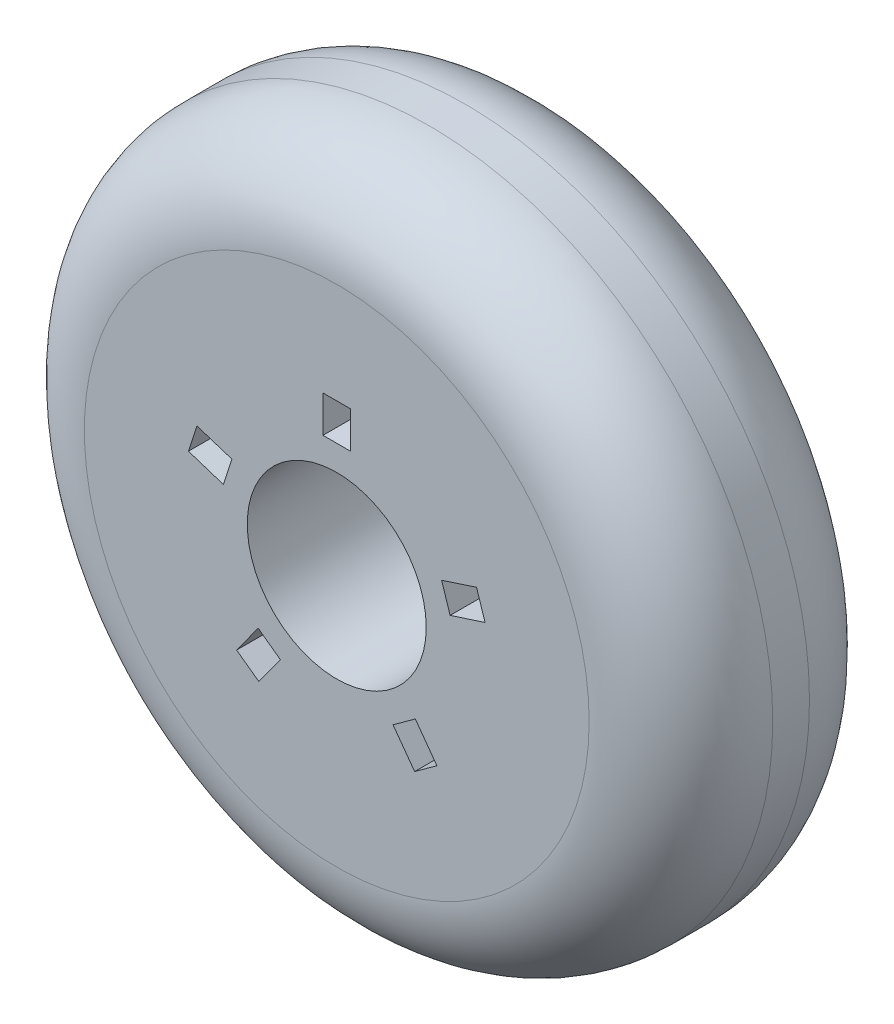
ISO-10303-21;
HEADER;
FILE_DESCRIPTION(('STEP AP214'),'2;1');
FILE_NAME('part.step','',(''),(''),'','','');
FILE_SCHEMA(('AUTOMOTIVE_DESIGN { 1 0 10303 214 1 1 1 1 }'));
ENDSEC;
DATA;
#1=APPLICATION_CONTEXT('core data for automotive mechanical design processes');
#2=APPLICATION_PROTOCOL_DEFINITION('international standard','automotive_design',2000,#1);
#3=PRODUCT_CONTEXT('',#1,'mechanical');
#4=PRODUCT('Part','Part','',(#3));
#5=PRODUCT_RELATED_PRODUCT_CATEGORY('part','',(#4));
#6=PRODUCT_DEFINITION_FORMATION('','',#4);
#7=PRODUCT_DEFINITION_CONTEXT('part definition',#1,'design');
#8=PRODUCT_DEFINITION('design','',#6,#7);
#9=PRODUCT_DEFINITION_SHAPE('','',#8);
#10=(LENGTH_UNIT() NAMED_UNIT(*) SI_UNIT(.MILLI.,.METRE.));
#11=(NAMED_UNIT(*) PLANE_ANGLE_UNIT() SI_UNIT($,.RADIAN.));
#12=(NAMED_UNIT(*) SI_UNIT($,.STERADIAN.) SOLID_ANGLE_UNIT());
#13=UNCERTAINTY_MEASURE_WITH_UNIT(LENGTH_MEASURE(1.E-05),#10,'distance_accuracy_value','');
#14=(GEOMETRIC_REPRESENTATION_CONTEXT(3) GLOBAL_UNCERTAINTY_ASSIGNED_CONTEXT((#13)) GLOBAL_UNIT_ASSIGNED_CONTEXT((#10,
#11,#12)) REPRESENTATION_CONTEXT('',''));
#15=CARTESIAN_POINT('',(0.,0.,0.));
#16=DIRECTION('',(0.,0.,1.));
#17=DIRECTION('',(1.,0.,0.));
#18=AXIS2_PLACEMENT_3D('',#15,#16,#17);
#19=CARTESIAN_POINT('',(0.,0.,24.));
#20=DIRECTION('',(0.,0.,1.));
#21=DIRECTION('',(1.,0.,0.));
#22=AXIS2_PLACEMENT_3D('',#19,#20,#21);
#23=PLANE('',#22);
#24=DIRECTION('',(0.,-1.,0.));
#25=VECTOR('',#24,1.);
#26=CARTESIAN_POINT('',(-1.5,16.5,24.));
#27=LINE('',#26,#25);
#28=CARTESIAN_POINT('',(-1.5,16.5,24.));
#29=VERTEX_POINT('',#28);
#30=CARTESIAN_POINT('',(-1.5,12.5,24.));
#31=VERTEX_POINT('',#30);
#32=EDGE_CURVE('E63',#29,#31,#27,.T.);
#33=ORIENTED_EDGE('',*,*,#32,.F.);
#34=DIRECTION('',(-1.,0.,0.));
#35=VECTOR('',#34,1.);
#36=CARTESIAN_POINT('',(-1.5,16.5,24.));
#37=LINE('',#36,#35);
#38=CARTESIAN_POINT('',(1.5,16.5,24.));
#39=VERTEX_POINT('',#38);
#40=EDGE_CURVE('E209',#39,#29,#37,.T.);
#41=ORIENTED_EDGE('',*,*,#40,.F.);
#42=DIRECTION('',(0.,1.,0.));
#43=VECTOR('',#42,1.);
#44=CARTESIAN_POINT('',(1.5,16.5,24.));
#45=LINE('',#44,#43);
#46=CARTESIAN_POINT('',(1.5,12.5,24.));
#47=VERTEX_POINT('',#46);
#48=EDGE_CURVE('E213',#47,#39,#45,.T.);
#49=ORIENTED_EDGE('',*,*,#48,.F.);
#50=DIRECTION('',(1.,0.,0.));
#51=VECTOR('',#50,1.);
#52=CARTESIAN_POINT('',(-1.5,12.5,24.));
#53=LINE('',#52,#51);
#54=EDGE_CURVE('E222',#31,#47,#53,.T.);
#55=ORIENTED_EDGE('',*,*,#54,.F.);
#56=EDGE_LOOP('',(#33,#41,#49,#55));
#57=FACE_BOUND('',#56,.T.);
#58=DIRECTION('',(-0.951056516295153,-0.309016994374948,0.));
#59=VECTOR('',#58,1.);
#60=CARTESIAN_POINT('',(15.228907027308,6.52536518162999,24.));
#61=LINE('',#60,#59);
#62=CARTESIAN_POINT('',(15.228907027308,6.52536518162999,24.));
#63=VERTEX_POINT('',#62);
#64=CARTESIAN_POINT('',(11.4246809621274,5.28929720413019,24.));
#65=VERTEX_POINT('',#64);
#66=EDGE_CURVE('E71',#63,#65,#61,.T.);
#67=ORIENTED_EDGE('',*,*,#66,.F.);
#68=DIRECTION('',(-0.309016994374948,0.951056516295154,0.));
#69=VECTOR('',#68,1.);
#70=CARTESIAN_POINT('',(15.228907027308,6.52536518162999,24.));
#71=LINE('',#70,#69);
#72=CARTESIAN_POINT('',(16.1559580104328,3.67219563274452,24.));
#73=VERTEX_POINT('',#72);
#74=EDGE_CURVE('E251',#73,#63,#71,.T.);
#75=ORIENTED_EDGE('',*,*,#74,.F.);
#76=DIRECTION('',(0.951056516295154,0.309016994374948,0.));
#77=VECTOR('',#76,1.);
#78=CARTESIAN_POINT('',(16.1559580104328,3.67219563274452,24.));
#79=LINE('',#78,#77);
#80=CARTESIAN_POINT('',(12.3517319452522,2.43612765524473,24.));
#81=VERTEX_POINT('',#80);
#82=EDGE_CURVE('E255',#81,#73,#79,.T.);
#83=ORIENTED_EDGE('',*,*,#82,.F.);
#84=DIRECTION('',(0.309016994374947,-0.951056516295154,0.));
#85=VECTOR('',#84,1.);
#86=CARTESIAN_POINT('',(11.4246809621274,5.28929720413019,24.));
#87=LINE('',#86,#85);
#88=EDGE_CURVE('E260',#65,#81,#87,.T.);
#89=ORIENTED_EDGE('',*,*,#88,.F.);
#90=EDGE_LOOP('',(#67,#75,#83,#89));
#91=FACE_BOUND('',#90,.T.);
#92=DIRECTION('',(-0.587785252292473,0.809016994374947,0.));
#93=VECTOR('',#92,1.);
#94=CARTESIAN_POINT('',(10.9119821543893,-12.4671025287475,24.));
#95=LINE('',#94,#93);
#96=CARTESIAN_POINT('',(10.9119821543893,-12.4671025287475,24.));
#97=VERTEX_POINT('',#96);
#98=CARTESIAN_POINT('',(8.5608411452194,-9.23103455124766,24.));
#99=VERTEX_POINT('',#98);
#100=EDGE_CURVE('E250',#97,#99,#95,.T.);
#101=ORIENTED_EDGE('',*,*,#100,.F.);
#102=DIRECTION('',(0.809016994374947,0.587785252292473,0.));
#103=VECTOR('',#102,1.);
#104=CARTESIAN_POINT('',(10.9119821543893,-12.4671025287475,24.));
#105=LINE('',#104,#103);
#106=CARTESIAN_POINT('',(8.48493117126445,-14.2304582856249,24.));
#107=VERTEX_POINT('',#106);
#108=EDGE_CURVE('E295',#107,#97,#105,.T.);
#109=ORIENTED_EDGE('',*,*,#108,.F.);
#110=DIRECTION('',(0.587785252292474,-0.809016994374947,0.));
#111=VECTOR('',#110,1.);
#112=CARTESIAN_POINT('',(8.48493117126445,-14.2304582856249,24.));
#113=LINE('',#112,#111);
#114=CARTESIAN_POINT('',(6.13379016209456,-10.9943903081251,24.));
#115=VERTEX_POINT('',#114);
#116=EDGE_CURVE('E299',#115,#107,#113,.T.);
#117=ORIENTED_EDGE('',*,*,#116,.F.);
#118=DIRECTION('',(-0.809016994374947,-0.587785252292474,0.));
#119=VECTOR('',#118,1.);
#120=CARTESIAN_POINT('',(8.5608411452194,-9.23103455124767,24.));
#121=LINE('',#120,#119);
#122=EDGE_CURVE('E304',#99,#115,#121,.T.);
#123=ORIENTED_EDGE('',*,*,#122,.F.);
#124=EDGE_LOOP('',(#101,#109,#117,#123));
#125=FACE_BOUND('',#124,.T.);
#126=DIRECTION('',(0.587785252292473,0.809016994374947,0.));
#127=VECTOR('',#126,1.);
#128=CARTESIAN_POINT('',(-8.48493117126225,-14.2304582856256,24.));
#129=LINE('',#128,#127);
#130=CARTESIAN_POINT('',(-8.48493117126225,-14.2304582856256,24.));
#131=VERTEX_POINT('',#130);
#132=CARTESIAN_POINT('',(-6.13379016209236,-10.9943903081258,24.));
#133=VERTEX_POINT('',#132);
#134=EDGE_CURVE('E294',#131,#133,#129,.T.);
#135=ORIENTED_EDGE('',*,*,#134,.F.);
#136=DIRECTION('',(0.809016994374947,-0.587785252292473,0.));
#137=VECTOR('',#136,1.);
#138=CARTESIAN_POINT('',(-8.48493117126225,-14.2304582856256,24.));
#139=LINE('',#138,#137);
#140=CARTESIAN_POINT('',(-10.9119821543871,-12.4671025287482,24.));
#141=VERTEX_POINT('',#140);
#142=EDGE_CURVE('E339',#141,#131,#139,.T.);
#143=ORIENTED_EDGE('',*,*,#142,.F.);
#144=DIRECTION('',(-0.587785252292473,-0.809016994374948,0.));
#145=VECTOR('',#144,1.);
#146=CARTESIAN_POINT('',(-10.9119821543871,-12.4671025287482,24.));
#147=LINE('',#146,#145);
#148=CARTESIAN_POINT('',(-8.5608411452172,-9.23103455124839,24.));
#149=VERTEX_POINT('',#148);
#150=EDGE_CURVE('E343',#149,#141,#147,.T.);
#151=ORIENTED_EDGE('',*,*,#150,.F.);
#152=DIRECTION('',(-0.809016994374948,0.587785252292472,0.));
#153=VECTOR('',#152,1.);
#154=CARTESIAN_POINT('',(-6.13379016209236,-10.9943903081258,24.));
#155=LINE('',#154,#153);
#156=EDGE_CURVE('E348',#133,#149,#155,.T.);
#157=ORIENTED_EDGE('',*,*,#156,.F.);
#158=EDGE_LOOP('',(#135,#143,#151,#157));
#159=FACE_BOUND('',#158,.T.);
#160=DIRECTION('',(0.951056516295154,-0.309016994374947,0.));
#161=VECTOR('',#160,1.);
#162=CARTESIAN_POINT('',(-16.155958010432,3.67219563274336,24.));
#163=LINE('',#162,#161);
#164=CARTESIAN_POINT('',(-16.155958010432,3.67219563274336,24.));
#165=VERTEX_POINT('',#164);
#166=CARTESIAN_POINT('',(-12.3517319452514,2.43612765524357,24.));
#167=VERTEX_POINT('',#166);
#168=EDGE_CURVE('E338',#165,#167,#163,.T.);
#169=ORIENTED_EDGE('',*,*,#168,.F.);
#170=DIRECTION('',(-0.309016994374948,-0.951056516295153,0.));
#171=VECTOR('',#170,1.);
#172=CARTESIAN_POINT('',(-16.155958010432,3.67219563274336,24.));
#173=LINE('',#172,#171);
#174=CARTESIAN_POINT('',(-15.2289070273071,6.52536518162882,24.));
#175=VERTEX_POINT('',#174);
#176=EDGE_CURVE('E382',#175,#165,#173,.T.);
#177=ORIENTED_EDGE('',*,*,#176,.F.);
#178=DIRECTION('',(-0.951056516295154,0.309016994374947,0.));
#179=VECTOR('',#178,1.);
#180=CARTESIAN_POINT('',(-15.2289070273071,6.52536518162882,24.));
#181=LINE('',#180,#179);
#182=CARTESIAN_POINT('',(-11.4246809621265,5.28929720412903,24.));
#183=VERTEX_POINT('',#182);
#184=EDGE_CURVE('E386',#183,#175,#181,.T.);
#185=ORIENTED_EDGE('',*,*,#184,.F.);
#186=DIRECTION('',(0.309016994374947,0.951056516295154,0.));
#187=VECTOR('',#186,1.);
#188=CARTESIAN_POINT('',(-12.3517319452514,2.43612765524357,24.));
#189=LINE('',#188,#187);
#190=EDGE_CURVE('E391',#167,#183,#189,.T.);
#191=ORIENTED_EDGE('',*,*,#190,.F.);
#192=EDGE_LOOP('',(#169,#177,#185,#191));
#193=FACE_BOUND('',#192,.T.);
#194=CARTESIAN_POINT('',(0.,0.,24.));
#195=DIRECTION('',(0.,0.,1.));
#196=DIRECTION('',(1.,0.,0.));
#197=AXIS2_PLACEMENT_3D('',#194,#195,#196);
#198=CIRCLE('',#197,27.5);
#199=CARTESIAN_POINT('',(27.5,0.,24.));
#200=VERTEX_POINT('',#199);
#201=EDGE_CURVE('E11',#200,#200,#198,.T.);
#202=ORIENTED_EDGE('',*,*,#201,.T.);
#203=EDGE_LOOP('',(#202));
#204=FACE_BOUND('',#203,.T.);
#205=CARTESIAN_POINT('',(0.,0.,24.));
#206=DIRECTION('',(0.,0.,1.));
#207=DIRECTION('',(1.,0.,0.));
#208=AXIS2_PLACEMENT_3D('',#205,#206,#207);
#209=CIRCLE('',#208,9.75);
#210=CARTESIAN_POINT('',(9.75,0.,24.));
#211=VERTEX_POINT('',#210);
#212=EDGE_CURVE('E411',#211,#211,#209,.T.);
#213=ORIENTED_EDGE('',*,*,#212,.F.);
#214=EDGE_LOOP('',(#213));
#215=FACE_BOUND('',#214,.T.);
#216=ADVANCED_FACE('F47',(#57,#91,#125,#159,#193,#204,#215),#23,.T.);
#217=CARTESIAN_POINT('',(0.,0.,0.));
#218=DIRECTION('',(0.,0.,1.));
#219=DIRECTION('',(1.,0.,0.));
#220=AXIS2_PLACEMENT_3D('',#217,#218,#219);
#221=PLANE('',#220);
#222=DIRECTION('',(-1.,0.,0.));
#223=VECTOR('',#222,1.);
#224=CARTESIAN_POINT('',(-1.5,16.5,0.));
#225=LINE('',#224,#223);
#226=CARTESIAN_POINT('',(1.5,16.5,0.));
#227=VERTEX_POINT('',#226);
#228=CARTESIAN_POINT('',(-1.5,16.5,0.));
#229=VERTEX_POINT('',#228);
#230=EDGE_CURVE('E194',#227,#229,#225,.T.);
#231=ORIENTED_EDGE('',*,*,#230,.T.);
#232=DIRECTION('',(0.,-1.,0.));
#233=VECTOR('',#232,1.);
#234=CARTESIAN_POINT('',(-1.5,16.5,0.));
#235=LINE('',#234,#233);
#236=CARTESIAN_POINT('',(-1.5,12.5,0.));
#237=VERTEX_POINT('',#236);
#238=EDGE_CURVE('E187',#229,#237,#235,.T.);
#239=ORIENTED_EDGE('',*,*,#238,.T.);
#240=DIRECTION('',(1.,0.,0.));
#241=VECTOR('',#240,1.);
#242=CARTESIAN_POINT('',(-1.5,12.5,0.));
#243=LINE('',#242,#241);
#244=CARTESIAN_POINT('',(1.5,12.5,0.));
#245=VERTEX_POINT('',#244);
#246=EDGE_CURVE('E198',#237,#245,#243,.T.);
#247=ORIENTED_EDGE('',*,*,#246,.T.);
#248=DIRECTION('',(0.,1.,0.));
#249=VECTOR('',#248,1.);
#250=CARTESIAN_POINT('',(1.5,16.5,0.));
#251=LINE('',#250,#249);
#252=EDGE_CURVE('E203',#245,#227,#251,.T.);
#253=ORIENTED_EDGE('',*,*,#252,.T.);
#254=EDGE_LOOP('',(#231,#239,#247,#253));
#255=FACE_BOUND('',#254,.T.);
#256=DIRECTION('',(-0.309016994374948,0.951056516295154,0.));
#257=VECTOR('',#256,1.);
#258=CARTESIAN_POINT('',(15.228907027308,6.52536518162999,0.));
#259=LINE('',#258,#257);
#260=CARTESIAN_POINT('',(16.1559580104328,3.67219563274452,0.));
#261=VERTEX_POINT('',#260);
#262=CARTESIAN_POINT('',(15.228907027308,6.52536518162999,0.));
#263=VERTEX_POINT('',#262);
#264=EDGE_CURVE('E240',#261,#263,#259,.T.);
#265=ORIENTED_EDGE('',*,*,#264,.T.);
#266=DIRECTION('',(-0.951056516295153,-0.309016994374948,0.));
#267=VECTOR('',#266,1.);
#268=CARTESIAN_POINT('',(15.228907027308,6.52536518162999,0.));
#269=LINE('',#268,#267);
#270=CARTESIAN_POINT('',(11.4246809621274,5.28929720413019,0.));
#271=VERTEX_POINT('',#270);
#272=EDGE_CURVE('E256',#263,#271,#269,.T.);
#273=ORIENTED_EDGE('',*,*,#272,.T.);
#274=DIRECTION('',(0.309016994374947,-0.951056516295154,0.));
#275=VECTOR('',#274,1.);
#276=CARTESIAN_POINT('',(11.4246809621274,5.28929720413019,0.));
#277=LINE('',#276,#275);
#278=CARTESIAN_POINT('',(12.3517319452522,2.43612765524473,0.));
#279=VERTEX_POINT('',#278);
#280=EDGE_CURVE('E273',#271,#279,#277,.T.);
#281=ORIENTED_EDGE('',*,*,#280,.T.);
#282=DIRECTION('',(0.951056516295154,0.309016994374948,0.));
#283=VECTOR('',#282,1.);
#284=CARTESIAN_POINT('',(16.1559580104328,3.67219563274452,0.));
#285=LINE('',#284,#283);
#286=EDGE_CURVE('E269',#279,#261,#285,.T.);
#287=ORIENTED_EDGE('',*,*,#286,.T.);
#288=EDGE_LOOP('',(#265,#273,#281,#287));
#289=FACE_BOUND('',#288,.T.);
#290=DIRECTION('',(0.809016994374947,0.587785252292473,0.));
#291=VECTOR('',#290,1.);
#292=CARTESIAN_POINT('',(10.9119821543893,-12.4671025287475,0.));
#293=LINE('',#292,#291);
#294=CARTESIAN_POINT('',(8.48493117126445,-14.2304582856249,0.));
#295=VERTEX_POINT('',#294);
#296=CARTESIAN_POINT('',(10.9119821543893,-12.4671025287475,0.));
#297=VERTEX_POINT('',#296);
#298=EDGE_CURVE('E284',#295,#297,#293,.T.);
#299=ORIENTED_EDGE('',*,*,#298,.T.);
#300=DIRECTION('',(-0.587785252292473,0.809016994374947,0.));
#301=VECTOR('',#300,1.);
#302=CARTESIAN_POINT('',(10.9119821543893,-12.4671025287475,0.));
#303=LINE('',#302,#301);
#304=CARTESIAN_POINT('',(8.5608411452194,-9.23103455124767,0.));
#305=VERTEX_POINT('',#304);
#306=EDGE_CURVE('E300',#297,#305,#303,.T.);
#307=ORIENTED_EDGE('',*,*,#306,.T.);
#308=DIRECTION('',(-0.809016994374947,-0.587785252292474,0.));
#309=VECTOR('',#308,1.);
#310=CARTESIAN_POINT('',(8.5608411452194,-9.23103455124767,0.));
#311=LINE('',#310,#309);
#312=CARTESIAN_POINT('',(6.13379016209456,-10.9943903081251,0.));
#313=VERTEX_POINT('',#312);
#314=EDGE_CURVE('E317',#305,#313,#311,.T.);
#315=ORIENTED_EDGE('',*,*,#314,.T.);
#316=DIRECTION('',(0.587785252292474,-0.809016994374947,0.));
#317=VECTOR('',#316,1.);
#318=CARTESIAN_POINT('',(8.48493117126445,-14.2304582856249,0.));
#319=LINE('',#318,#317);
#320=EDGE_CURVE('E313',#313,#295,#319,.T.);
#321=ORIENTED_EDGE('',*,*,#320,.T.);
#322=EDGE_LOOP('',(#299,#307,#315,#321));
#323=FACE_BOUND('',#322,.T.);
#324=DIRECTION('',(0.809016994374947,-0.587785252292473,0.));
#325=VECTOR('',#324,1.);
#326=CARTESIAN_POINT('',(-8.48493117126225,-14.2304582856256,0.));
#327=LINE('',#326,#325);
#328=CARTESIAN_POINT('',(-10.9119821543871,-12.4671025287482,0.));
#329=VERTEX_POINT('',#328);
#330=CARTESIAN_POINT('',(-8.48493117126225,-14.2304582856256,0.));
#331=VERTEX_POINT('',#330);
#332=EDGE_CURVE('E328',#329,#331,#327,.T.);
#333=ORIENTED_EDGE('',*,*,#332,.T.);
#334=DIRECTION('',(0.587785252292473,0.809016994374947,0.));
#335=VECTOR('',#334,1.);
#336=CARTESIAN_POINT('',(-8.48493117126225,-14.2304582856256,0.));
#337=LINE('',#336,#335);
#338=CARTESIAN_POINT('',(-6.13379016209236,-10.9943903081258,0.));
#339=VERTEX_POINT('',#338);
#340=EDGE_CURVE('E344',#331,#339,#337,.T.);
#341=ORIENTED_EDGE('',*,*,#340,.T.);
#342=DIRECTION('',(-0.809016994374948,0.587785252292472,0.));
#343=VECTOR('',#342,1.);
#344=CARTESIAN_POINT('',(-6.13379016209236,-10.9943903081258,0.));
#345=LINE('',#344,#343);
#346=CARTESIAN_POINT('',(-8.5608411452172,-9.23103455124839,0.));
#347=VERTEX_POINT('',#346);
#348=EDGE_CURVE('E361',#339,#347,#345,.T.);
#349=ORIENTED_EDGE('',*,*,#348,.T.);
#350=DIRECTION('',(-0.587785252292473,-0.809016994374948,0.));
#351=VECTOR('',#350,1.);
#352=CARTESIAN_POINT('',(-10.9119821543871,-12.4671025287482,0.));
#353=LINE('',#352,#351);
#354=EDGE_CURVE('E357',#347,#329,#353,.T.);
#355=ORIENTED_EDGE('',*,*,#354,.T.);
#356=EDGE_LOOP('',(#333,#341,#349,#355));
#357=FACE_BOUND('',#356,.T.);
#358=DIRECTION('',(-0.309016994374948,-0.951056516295153,0.));
#359=VECTOR('',#358,1.);
#360=CARTESIAN_POINT('',(-16.155958010432,3.67219563274336,0.));
#361=LINE('',#360,#359);
#362=CARTESIAN_POINT('',(-15.2289070273071,6.52536518162882,0.));
#363=VERTEX_POINT('',#362);
#364=CARTESIAN_POINT('',(-16.155958010432,3.67219563274336,0.));
#365=VERTEX_POINT('',#364);
#366=EDGE_CURVE('E372',#363,#365,#361,.T.);
#367=ORIENTED_EDGE('',*,*,#366,.T.);
#368=DIRECTION('',(0.951056516295154,-0.309016994374947,0.));
#369=VECTOR('',#368,1.);
#370=CARTESIAN_POINT('',(-16.155958010432,3.67219563274336,0.));
#371=LINE('',#370,#369);
#372=CARTESIAN_POINT('',(-12.3517319452514,2.43612765524357,0.));
#373=VERTEX_POINT('',#372);
#374=EDGE_CURVE('E387',#365,#373,#371,.T.);
#375=ORIENTED_EDGE('',*,*,#374,.T.);
#376=DIRECTION('',(0.309016994374947,0.951056516295154,0.));
#377=VECTOR('',#376,1.);
#378=CARTESIAN_POINT('',(-12.3517319452514,2.43612765524357,0.));
#379=LINE('',#378,#377);
#380=CARTESIAN_POINT('',(-11.4246809621265,5.28929720412903,0.));
#381=VERTEX_POINT('',#380);
#382=EDGE_CURVE('E404',#373,#381,#379,.T.);
#383=ORIENTED_EDGE('',*,*,#382,.T.);
#384=DIRECTION('',(-0.951056516295154,0.309016994374947,0.));
#385=VECTOR('',#384,1.);
#386=CARTESIAN_POINT('',(-15.2289070273071,6.52536518162882,0.));
#387=LINE('',#386,#385);
#388=EDGE_CURVE('E400',#381,#363,#387,.T.);
#389=ORIENTED_EDGE('',*,*,#388,.T.);
#390=EDGE_LOOP('',(#367,#375,#383,#389));
#391=FACE_BOUND('',#390,.T.);
#392=CARTESIAN_POINT('',(0.,0.,0.));
#393=DIRECTION('',(0.,0.,1.));
#394=DIRECTION('',(1.,0.,0.));
#395=AXIS2_PLACEMENT_3D('',#392,#393,#394);
#396=CIRCLE('',#395,27.5);
#397=CARTESIAN_POINT('',(27.5,0.,0.));
#398=VERTEX_POINT('',#397);
#399=EDGE_CURVE('E56',#398,#398,#396,.F.);
#400=ORIENTED_EDGE('',*,*,#399,.T.);
#401=EDGE_LOOP('',(#400));
#402=FACE_BOUND('',#401,.T.);
#403=CARTESIAN_POINT('',(0.,0.,0.));
#404=DIRECTION('',(0.,0.,1.));
#405=DIRECTION('',(1.,0.,0.));
#406=AXIS2_PLACEMENT_3D('',#403,#404,#405);
#407=CIRCLE('',#406,9.75);
#408=CARTESIAN_POINT('',(9.75,0.,0.));
#409=VERTEX_POINT('',#408);
#410=EDGE_CURVE('E231',#409,#409,#407,.T.);
#411=ORIENTED_EDGE('',*,*,#410,.T.);
#412=EDGE_LOOP('',(#411));
#413=FACE_BOUND('',#412,.T.);
#414=ADVANCED_FACE('F205',(#255,#289,#323,#357,#391,#402,#413),#221,.F.);
#415=CARTESIAN_POINT('',(0.,0.,24.));
#416=DIRECTION('',(0.,0.,-1.));
#417=DIRECTION('',(-1.,0.,0.));
#418=AXIS2_PLACEMENT_3D('',#415,#416,#417);
#419=CYLINDRICAL_SURFACE('',#418,37.5);
#420=CARTESIAN_POINT('',(0.,0.,10.));
#421=DIRECTION('',(0.,0.,1.));
#422=DIRECTION('',(1.,0.,0.));
#423=AXIS2_PLACEMENT_3D('',#420,#421,#422);
#424=CIRCLE('',#423,37.5);
#425=CARTESIAN_POINT('',(37.5,0.,10.));
#426=VERTEX_POINT('',#425);
#427=EDGE_CURVE('E422',#426,#426,#424,.T.);
#428=ORIENTED_EDGE('',*,*,#427,.T.);
#429=EDGE_LOOP('',(#428));
#430=FACE_BOUND('',#429,.T.);
#431=CARTESIAN_POINT('',(0.,0.,14.));
#432=DIRECTION('',(0.,0.,1.));
#433=DIRECTION('',(1.,0.,0.));
#434=AXIS2_PLACEMENT_3D('',#431,#432,#433);
#435=CIRCLE('',#434,37.5);
#436=CARTESIAN_POINT('',(37.5,0.,14.));
#437=VERTEX_POINT('',#436);
#438=EDGE_CURVE('E415',#437,#437,#435,.F.);
#439=ORIENTED_EDGE('',*,*,#438,.T.);
#440=EDGE_LOOP('',(#439));
#441=FACE_BOUND('',#440,.T.);
#442=ADVANCED_FACE('F437',(#430,#441),#419,.T.);
#443=CARTESIAN_POINT('',(0.,0.,24.));
#444=DIRECTION('',(0.,0.,-1.));
#445=DIRECTION('',(-1.,0.,0.));
#446=AXIS2_PLACEMENT_3D('',#443,#444,#445);
#447=CYLINDRICAL_SURFACE('',#446,9.75);
#448=ORIENTED_EDGE('',*,*,#212,.T.);
#449=EDGE_LOOP('',(#448));
#450=FACE_BOUND('',#449,.T.);
#451=ORIENTED_EDGE('',*,*,#410,.F.);
#452=EDGE_LOOP('',(#451));
#453=FACE_BOUND('',#452,.T.);
#454=ADVANCED_FACE('F434',(#450,#453),#447,.F.);
#455=CARTESIAN_POINT('',(0.,0.,10.));
#456=DIRECTION('',(0.,0.,1.));
#457=DIRECTION('',(1.,0.,0.));
#458=AXIS2_PLACEMENT_3D('',#455,#456,#457);
#459=TOROIDAL_SURFACE('',#458,27.5,10.);
#460=ORIENTED_EDGE('',*,*,#399,.F.);
#461=EDGE_LOOP('',(#460));
#462=FACE_BOUND('',#461,.T.);
#463=ORIENTED_EDGE('',*,*,#427,.F.);
#464=EDGE_LOOP('',(#463));
#465=FACE_BOUND('',#464,.T.);
#466=ADVANCED_FACE('F431',(#462,#465),#459,.T.);
#467=CARTESIAN_POINT('',(0.,0.,14.));
#468=DIRECTION('',(0.,0.,1.));
#469=DIRECTION('',(1.,0.,0.));
#470=AXIS2_PLACEMENT_3D('',#467,#468,#469);
#471=TOROIDAL_SURFACE('',#470,27.5,10.);
#472=ORIENTED_EDGE('',*,*,#438,.F.);
#473=EDGE_LOOP('',(#472));
#474=FACE_BOUND('',#473,.T.);
#475=ORIENTED_EDGE('',*,*,#201,.F.);
#476=EDGE_LOOP('',(#475));
#477=FACE_BOUND('',#476,.T.);
#478=ADVANCED_FACE('F49',(#474,#477),#471,.T.);
#479=CARTESIAN_POINT('',(-16.155958010432,3.67219563274336,0.));
#480=DIRECTION('',(-0.309016994374947,-0.951056516295154,0.));
#481=DIRECTION('',(0.951056516295154,-0.309016994374947,0.));
#482=AXIS2_PLACEMENT_3D('',#479,#480,#481);
#483=PLANE('',#482);
#484=ORIENTED_EDGE('',*,*,#168,.T.);
#485=DIRECTION('',(0.,0.,1.));
#486=VECTOR('',#485,1.);
#487=CARTESIAN_POINT('',(-12.3517319452514,2.43612765524357,0.));
#488=LINE('',#487,#486);
#489=EDGE_CURVE('E368',#373,#167,#488,.T.);
#490=ORIENTED_EDGE('',*,*,#489,.F.);
#491=ORIENTED_EDGE('',*,*,#374,.F.);
#492=DIRECTION('',(0.,0.,1.));
#493=VECTOR('',#492,1.);
#494=CARTESIAN_POINT('',(-16.155958010432,3.67219563274336,0.));
#495=LINE('',#494,#493);
#496=EDGE_CURVE('E379',#365,#165,#495,.T.);
#497=ORIENTED_EDGE('',*,*,#496,.T.);
#498=EDGE_LOOP('',(#484,#490,#491,#497));
#499=FACE_BOUND('',#498,.T.);
#500=ADVANCED_FACE('F445',(#499),#483,.F.);
#501=CARTESIAN_POINT('',(-16.155958010432,3.67219563274336,0.));
#502=DIRECTION('',(-0.951056516295154,0.309016994374948,0.));
#503=DIRECTION('',(-0.309016994374948,-0.951056516295154,0.));
#504=AXIS2_PLACEMENT_3D('',#501,#502,#503);
#505=PLANE('',#504);
#506=ORIENTED_EDGE('',*,*,#176,.T.);
#507=ORIENTED_EDGE('',*,*,#496,.F.);
#508=ORIENTED_EDGE('',*,*,#366,.F.);
#509=DIRECTION('',(0.,0.,1.));
#510=VECTOR('',#509,1.);
#511=CARTESIAN_POINT('',(-15.2289070273071,6.52536518162882,0.));
#512=LINE('',#511,#510);
#513=EDGE_CURVE('E376',#363,#175,#512,.T.);
#514=ORIENTED_EDGE('',*,*,#513,.T.);
#515=EDGE_LOOP('',(#506,#507,#508,#514));
#516=FACE_BOUND('',#515,.T.);
#517=ADVANCED_FACE('F464',(#516),#505,.F.);
#518=CARTESIAN_POINT('',(-15.2289070273071,6.52536518162882,0.));
#519=DIRECTION('',(0.309016994374947,0.951056516295154,0.));
#520=DIRECTION('',(-0.951056516295154,0.309016994374947,0.));
#521=AXIS2_PLACEMENT_3D('',#518,#519,#520);
#522=PLANE('',#521);
#523=ORIENTED_EDGE('',*,*,#184,.T.);
#524=ORIENTED_EDGE('',*,*,#513,.F.);
#525=ORIENTED_EDGE('',*,*,#388,.F.);
#526=DIRECTION('',(0.,0.,1.));
#527=VECTOR('',#526,1.);
#528=CARTESIAN_POINT('',(-11.4246809621265,5.28929720412903,0.));
#529=LINE('',#528,#527);
#530=EDGE_CURVE('E373',#381,#183,#529,.T.);
#531=ORIENTED_EDGE('',*,*,#530,.T.);
#532=EDGE_LOOP('',(#523,#524,#525,#531));
#533=FACE_BOUND('',#532,.T.);
#534=ADVANCED_FACE('F467',(#533),#522,.F.);
#535=CARTESIAN_POINT('',(-12.3517319452514,2.43612765524357,0.));
#536=DIRECTION('',(0.951056516295154,-0.309016994374947,0.));
#537=DIRECTION('',(0.309016994374947,0.951056516295154,0.));
#538=AXIS2_PLACEMENT_3D('',#535,#536,#537);
#539=PLANE('',#538);
#540=ORIENTED_EDGE('',*,*,#190,.T.);
#541=ORIENTED_EDGE('',*,*,#530,.F.);
#542=ORIENTED_EDGE('',*,*,#382,.F.);
#543=ORIENTED_EDGE('',*,*,#489,.T.);
#544=EDGE_LOOP('',(#540,#541,#542,#543));
#545=FACE_BOUND('',#544,.T.);
#546=ADVANCED_FACE('F471',(#545),#539,.F.);
#547=CARTESIAN_POINT('',(-8.48493117126225,-14.2304582856256,0.));
#548=DIRECTION('',(0.809016994374948,-0.587785252292473,0.));
#549=DIRECTION('',(0.587785252292473,0.809016994374948,0.));
#550=AXIS2_PLACEMENT_3D('',#547,#548,#549);
#551=PLANE('',#550);
#552=ORIENTED_EDGE('',*,*,#134,.T.);
#553=DIRECTION('',(0.,0.,1.));
#554=VECTOR('',#553,1.);
#555=CARTESIAN_POINT('',(-6.13379016209236,-10.9943903081258,0.));
#556=LINE('',#555,#554);
#557=EDGE_CURVE('E324',#339,#133,#556,.T.);
#558=ORIENTED_EDGE('',*,*,#557,.F.);
#559=ORIENTED_EDGE('',*,*,#340,.F.);
#560=DIRECTION('',(0.,0.,1.));
#561=VECTOR('',#560,1.);
#562=CARTESIAN_POINT('',(-8.48493117126225,-14.2304582856256,0.));
#563=LINE('',#562,#561);
#564=EDGE_CURVE('E335',#331,#131,#563,.T.);
#565=ORIENTED_EDGE('',*,*,#564,.T.);
#566=EDGE_LOOP('',(#552,#558,#559,#565));
#567=FACE_BOUND('',#566,.T.);
#568=ADVANCED_FACE('F475',(#567),#551,.F.);
#569=CARTESIAN_POINT('',(-8.48493117126225,-14.2304582856256,0.));
#570=DIRECTION('',(-0.587785252292473,-0.809016994374947,0.));
#571=DIRECTION('',(0.809016994374948,-0.587785252292473,0.));
#572=AXIS2_PLACEMENT_3D('',#569,#570,#571);
#573=PLANE('',#572);
#574=ORIENTED_EDGE('',*,*,#142,.T.);
#575=ORIENTED_EDGE('',*,*,#564,.F.);
#576=ORIENTED_EDGE('',*,*,#332,.F.);
#577=DIRECTION('',(0.,0.,1.));
#578=VECTOR('',#577,1.);
#579=CARTESIAN_POINT('',(-10.9119821543871,-12.4671025287482,0.));
#580=LINE('',#579,#578);
#581=EDGE_CURVE('E332',#329,#141,#580,.T.);
#582=ORIENTED_EDGE('',*,*,#581,.T.);
#583=EDGE_LOOP('',(#574,#575,#576,#582));
#584=FACE_BOUND('',#583,.T.);
#585=ADVANCED_FACE('F479',(#584),#573,.F.);
#586=CARTESIAN_POINT('',(-10.9119821543871,-12.4671025287482,0.));
#587=DIRECTION('',(-0.809016994374948,0.587785252292473,0.));
#588=DIRECTION('',(-0.587785252292473,-0.809016994374948,0.));
#589=AXIS2_PLACEMENT_3D('',#586,#587,#588);
#590=PLANE('',#589);
#591=ORIENTED_EDGE('',*,*,#150,.T.);
#592=ORIENTED_EDGE('',*,*,#581,.F.);
#593=ORIENTED_EDGE('',*,*,#354,.F.);
#594=DIRECTION('',(0.,0.,1.));
#595=VECTOR('',#594,1.);
#596=CARTESIAN_POINT('',(-8.5608411452172,-9.23103455124839,0.));
#597=LINE('',#596,#595);
#598=EDGE_CURVE('E329',#347,#149,#597,.T.);
#599=ORIENTED_EDGE('',*,*,#598,.T.);
#600=EDGE_LOOP('',(#591,#592,#593,#599));
#601=FACE_BOUND('',#600,.T.);
#602=ADVANCED_FACE('F482',(#601),#590,.F.);
#603=CARTESIAN_POINT('',(-6.13379016209236,-10.9943903081258,0.));
#604=DIRECTION('',(0.587785252292472,0.809016994374948,0.));
#605=DIRECTION('',(-0.809016994374948,0.587785252292472,0.));
#606=AXIS2_PLACEMENT_3D('',#603,#604,#605);
#607=PLANE('',#606);
#608=ORIENTED_EDGE('',*,*,#156,.T.);
#609=ORIENTED_EDGE('',*,*,#598,.F.);
#610=ORIENTED_EDGE('',*,*,#348,.F.);
#611=ORIENTED_EDGE('',*,*,#557,.T.);
#612=EDGE_LOOP('',(#608,#609,#610,#611));
#613=FACE_BOUND('',#612,.T.);
#614=ADVANCED_FACE('F486',(#613),#607,.F.);
#615=CARTESIAN_POINT('',(10.9119821543893,-12.4671025287475,0.));
#616=DIRECTION('',(0.809016994374947,0.587785252292473,0.));
#617=DIRECTION('',(-0.587785252292473,0.809016994374947,0.));
#618=AXIS2_PLACEMENT_3D('',#615,#616,#617);
#619=PLANE('',#618);
#620=ORIENTED_EDGE('',*,*,#100,.T.);
#621=DIRECTION('',(0.,0.,1.));
#622=VECTOR('',#621,1.);
#623=CARTESIAN_POINT('',(8.5608411452194,-9.23103455124767,0.));
#624=LINE('',#623,#622);
#625=EDGE_CURVE('E280',#305,#99,#624,.T.);
#626=ORIENTED_EDGE('',*,*,#625,.F.);
#627=ORIENTED_EDGE('',*,*,#306,.F.);
#628=DIRECTION('',(0.,0.,1.));
#629=VECTOR('',#628,1.);
#630=CARTESIAN_POINT('',(10.9119821543893,-12.4671025287475,0.));
#631=LINE('',#630,#629);
#632=EDGE_CURVE('E291',#297,#97,#631,.T.);
#633=ORIENTED_EDGE('',*,*,#632,.T.);
#634=EDGE_LOOP('',(#620,#626,#627,#633));
#635=FACE_BOUND('',#634,.T.);
#636=ADVANCED_FACE('F490',(#635),#619,.F.);
#637=CARTESIAN_POINT('',(10.9119821543893,-12.4671025287475,0.));
#638=DIRECTION('',(0.587785252292473,-0.809016994374947,0.));
#639=DIRECTION('',(0.809016994374948,0.587785252292473,0.));
#640=AXIS2_PLACEMENT_3D('',#637,#638,#639);
#641=PLANE('',#640);
#642=ORIENTED_EDGE('',*,*,#108,.T.);
#643=ORIENTED_EDGE('',*,*,#632,.F.);
#644=ORIENTED_EDGE('',*,*,#298,.F.);
#645=DIRECTION('',(0.,0.,1.));
#646=VECTOR('',#645,1.);
#647=CARTESIAN_POINT('',(8.48493117126445,-14.2304582856249,0.));
#648=LINE('',#647,#646);
#649=EDGE_CURVE('E288',#295,#107,#648,.T.);
#650=ORIENTED_EDGE('',*,*,#649,.T.);
#651=EDGE_LOOP('',(#642,#643,#644,#650));
#652=FACE_BOUND('',#651,.T.);
#653=ADVANCED_FACE('F495',(#652),#641,.F.);
#654=CARTESIAN_POINT('',(8.48493117126445,-14.2304582856249,0.));
#655=DIRECTION('',(-0.809016994374947,-0.587785252292474,0.));
#656=DIRECTION('',(0.587785252292474,-0.809016994374947,0.));
#657=AXIS2_PLACEMENT_3D('',#654,#655,#656);
#658=PLANE('',#657);
#659=ORIENTED_EDGE('',*,*,#116,.T.);
#660=ORIENTED_EDGE('',*,*,#649,.F.);
#661=ORIENTED_EDGE('',*,*,#320,.F.);
#662=DIRECTION('',(0.,0.,1.));
#663=VECTOR('',#662,1.);
#664=CARTESIAN_POINT('',(6.13379016209456,-10.9943903081251,0.));
#665=LINE('',#664,#663);
#666=EDGE_CURVE('E285',#313,#115,#665,.T.);
#667=ORIENTED_EDGE('',*,*,#666,.T.);
#668=EDGE_LOOP('',(#659,#660,#661,#667));
#669=FACE_BOUND('',#668,.T.);
#670=ADVANCED_FACE('F498',(#669),#658,.F.);
#671=CARTESIAN_POINT('',(8.5608411452194,-9.23103455124767,0.));
#672=DIRECTION('',(-0.587785252292474,0.809016994374947,0.));
#673=DIRECTION('',(-0.809016994374947,-0.587785252292474,0.));
#674=AXIS2_PLACEMENT_3D('',#671,#672,#673);
#675=PLANE('',#674);
#676=ORIENTED_EDGE('',*,*,#122,.T.);
#677=ORIENTED_EDGE('',*,*,#666,.F.);
#678=ORIENTED_EDGE('',*,*,#314,.F.);
#679=ORIENTED_EDGE('',*,*,#625,.T.);
#680=EDGE_LOOP('',(#676,#677,#678,#679));
#681=FACE_BOUND('',#680,.T.);
#682=ADVANCED_FACE('F502',(#681),#675,.F.);
#683=CARTESIAN_POINT('',(15.228907027308,6.52536518162999,0.));
#684=DIRECTION('',(-0.309016994374948,0.951056516295153,0.));
#685=DIRECTION('',(-0.951056516295154,-0.309016994374948,0.));
#686=AXIS2_PLACEMENT_3D('',#683,#684,#685);
#687=PLANE('',#686);
#688=ORIENTED_EDGE('',*,*,#66,.T.);
#689=DIRECTION('',(0.,0.,1.));
#690=VECTOR('',#689,1.);
#691=CARTESIAN_POINT('',(11.4246809621274,5.28929720413019,0.));
#692=LINE('',#691,#690);
#693=EDGE_CURVE('E237',#271,#65,#692,.T.);
#694=ORIENTED_EDGE('',*,*,#693,.F.);
#695=ORIENTED_EDGE('',*,*,#272,.F.);
#696=DIRECTION('',(0.,0.,1.));
#697=VECTOR('',#696,1.);
#698=CARTESIAN_POINT('',(15.228907027308,6.52536518162999,0.));
#699=LINE('',#698,#697);
#700=EDGE_CURVE('E247',#263,#63,#699,.T.);
#701=ORIENTED_EDGE('',*,*,#700,.T.);
#702=EDGE_LOOP('',(#688,#694,#695,#701));
#703=FACE_BOUND('',#702,.T.);
#704=ADVANCED_FACE('F506',(#703),#687,.F.);
#705=CARTESIAN_POINT('',(15.228907027308,6.52536518162999,0.));
#706=DIRECTION('',(0.951056516295153,0.309016994374948,0.));
#707=DIRECTION('',(-0.309016994374948,0.951056516295154,0.));
#708=AXIS2_PLACEMENT_3D('',#705,#706,#707);
#709=PLANE('',#708);
#710=ORIENTED_EDGE('',*,*,#74,.T.);
#711=ORIENTED_EDGE('',*,*,#700,.F.);
#712=ORIENTED_EDGE('',*,*,#264,.F.);
#713=DIRECTION('',(0.,0.,1.));
#714=VECTOR('',#713,1.);
#715=CARTESIAN_POINT('',(16.1559580104328,3.67219563274452,0.));
#716=LINE('',#715,#714);
#717=EDGE_CURVE('E244',#261,#73,#716,.T.);
#718=ORIENTED_EDGE('',*,*,#717,.T.);
#719=EDGE_LOOP('',(#710,#711,#712,#718));
#720=FACE_BOUND('',#719,.T.);
#721=ADVANCED_FACE('F511',(#720),#709,.F.);
#722=CARTESIAN_POINT('',(16.1559580104328,3.67219563274452,0.));
#723=DIRECTION('',(0.309016994374948,-0.951056516295153,0.));
#724=DIRECTION('',(0.951056516295154,0.309016994374948,0.));
#725=AXIS2_PLACEMENT_3D('',#722,#723,#724);
#726=PLANE('',#725);
#727=ORIENTED_EDGE('',*,*,#82,.T.);
#728=ORIENTED_EDGE('',*,*,#717,.F.);
#729=ORIENTED_EDGE('',*,*,#286,.F.);
#730=DIRECTION('',(0.,0.,1.));
#731=VECTOR('',#730,1.);
#732=CARTESIAN_POINT('',(12.3517319452522,2.43612765524473,0.));
#733=LINE('',#732,#731);
#734=EDGE_CURVE('E241',#279,#81,#733,.T.);
#735=ORIENTED_EDGE('',*,*,#734,.T.);
#736=EDGE_LOOP('',(#727,#728,#729,#735));
#737=FACE_BOUND('',#736,.T.);
#738=ADVANCED_FACE('F514',(#737),#726,.F.);
#739=CARTESIAN_POINT('',(11.4246809621274,5.28929720413019,0.));
#740=DIRECTION('',(-0.951056516295154,-0.309016994374947,0.));
#741=DIRECTION('',(0.309016994374947,-0.951056516295154,0.));
#742=AXIS2_PLACEMENT_3D('',#739,#740,#741);
#743=PLANE('',#742);
#744=ORIENTED_EDGE('',*,*,#88,.T.);
#745=ORIENTED_EDGE('',*,*,#734,.F.);
#746=ORIENTED_EDGE('',*,*,#280,.F.);
#747=ORIENTED_EDGE('',*,*,#693,.T.);
#748=EDGE_LOOP('',(#744,#745,#746,#747));
#749=FACE_BOUND('',#748,.T.);
#750=ADVANCED_FACE('F518',(#749),#743,.F.);
#751=CARTESIAN_POINT('',(-1.5,16.5,0.));
#752=DIRECTION('',(-1.,0.,0.));
#753=DIRECTION('',(0.,-1.,0.));
#754=AXIS2_PLACEMENT_3D('',#751,#752,#753);
#755=PLANE('',#754);
#756=ORIENTED_EDGE('',*,*,#32,.T.);
#757=DIRECTION('',(0.,0.,1.));
#758=VECTOR('',#757,1.);
#759=CARTESIAN_POINT('',(-1.5,12.5,0.));
#760=LINE('',#759,#758);
#761=EDGE_CURVE('E183',#237,#31,#760,.T.);
#762=ORIENTED_EDGE('',*,*,#761,.F.);
#763=ORIENTED_EDGE('',*,*,#238,.F.);
#764=DIRECTION('',(0.,0.,1.));
#765=VECTOR('',#764,1.);
#766=CARTESIAN_POINT('',(-1.5,16.5,0.));
#767=LINE('',#766,#765);
#768=EDGE_CURVE('E228',#229,#29,#767,.T.);
#769=ORIENTED_EDGE('',*,*,#768,.T.);
#770=EDGE_LOOP('',(#756,#762,#763,#769));
#771=FACE_BOUND('',#770,.T.);
#772=ADVANCED_FACE('F185',(#771),#755,.F.);
#773=CARTESIAN_POINT('',(-1.5,16.5,0.));
#774=DIRECTION('',(0.,1.,0.));
#775=DIRECTION('',(0.,0.,1.));
#776=AXIS2_PLACEMENT_3D('',#773,#774,#775);
#777=PLANE('',#776);
#778=ORIENTED_EDGE('',*,*,#40,.T.);
#779=ORIENTED_EDGE('',*,*,#768,.F.);
#780=ORIENTED_EDGE('',*,*,#230,.F.);
#781=DIRECTION('',(0.,0.,1.));
#782=VECTOR('',#781,1.);
#783=CARTESIAN_POINT('',(1.5,16.5,0.));
#784=LINE('',#783,#782);
#785=EDGE_CURVE('E232',#227,#39,#784,.T.);
#786=ORIENTED_EDGE('',*,*,#785,.T.);
#787=EDGE_LOOP('',(#778,#779,#780,#786));
#788=FACE_BOUND('',#787,.T.);
#789=ADVANCED_FACE('F527',(#788),#777,.F.);
#790=CARTESIAN_POINT('',(1.5,16.5,0.));
#791=DIRECTION('',(1.,0.,0.));
#792=DIRECTION('',(0.,1.,0.));
#793=AXIS2_PLACEMENT_3D('',#790,#791,#792);
#794=PLANE('',#793);
#795=ORIENTED_EDGE('',*,*,#48,.T.);
#796=ORIENTED_EDGE('',*,*,#785,.F.);
#797=ORIENTED_EDGE('',*,*,#252,.F.);
#798=DIRECTION('',(0.,0.,1.));
#799=VECTOR('',#798,1.);
#800=CARTESIAN_POINT('',(1.5,12.5,0.));
#801=LINE('',#800,#799);
#802=EDGE_CURVE('E193',#245,#47,#801,.T.);
#803=ORIENTED_EDGE('',*,*,#802,.T.);
#804=EDGE_LOOP('',(#795,#796,#797,#803));
#805=FACE_BOUND('',#804,.T.);
#806=ADVANCED_FACE('F530',(#805),#794,.F.);
#807=CARTESIAN_POINT('',(-1.5,12.5,0.));
#808=DIRECTION('',(0.,-1.,0.));
#809=DIRECTION('',(0.,0.,-1.));
#810=AXIS2_PLACEMENT_3D('',#807,#808,#809);
#811=PLANE('',#810);
#812=ORIENTED_EDGE('',*,*,#54,.T.);
#813=ORIENTED_EDGE('',*,*,#802,.F.);
#814=ORIENTED_EDGE('',*,*,#246,.F.);
#815=ORIENTED_EDGE('',*,*,#761,.T.);
#816=EDGE_LOOP('',(#812,#813,#814,#815));
#817=FACE_BOUND('',#816,.T.);
#818=ADVANCED_FACE('F199',(#817),#811,.F.);
#819=CLOSED_SHELL('',(#216,#414,#442,#454,#466,#478,#500,#517,#534,#546,#568,#585,#602,#614,
#636,#653,#670,#682,#704,#721,#738,#750,#772,#789,#806,#818));
#820=MANIFOLD_SOLID_BREP('B2',#819);
#821=ADVANCED_BREP_SHAPE_REPRESENTATION('',(#18,#820),#14);
#822=SHAPE_DEFINITION_REPRESENTATION(#9,#821);
ENDSEC;
END-ISO-10303-21;
